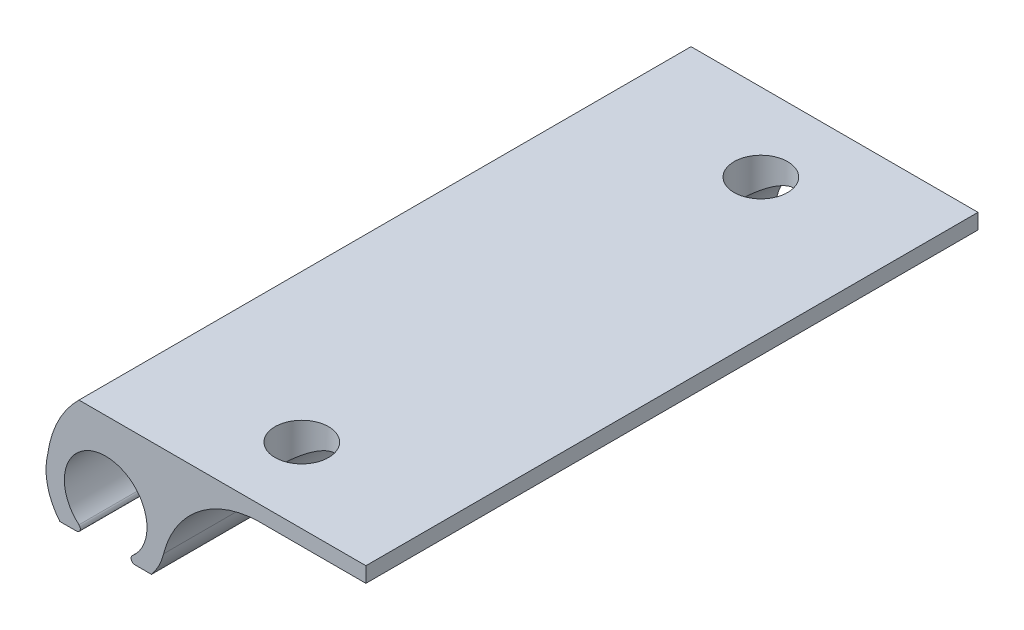
ISO-10303-21;
HEADER;
FILE_DESCRIPTION(('STEP AP214'),'2;1');
FILE_NAME('part.step','',(''),(''),'','','');
FILE_SCHEMA(('AUTOMOTIVE_DESIGN { 1 0 10303 214 1 1 1 1 }'));
ENDSEC;
DATA;
#1=APPLICATION_CONTEXT('core data for automotive mechanical design processes');
#2=APPLICATION_PROTOCOL_DEFINITION('international standard','automotive_design',2000,#1);
#3=PRODUCT_CONTEXT('',#1,'mechanical');
#4=PRODUCT('Part','Part','',(#3));
#5=PRODUCT_RELATED_PRODUCT_CATEGORY('part','',(#4));
#6=PRODUCT_DEFINITION_FORMATION('','',#4);
#7=PRODUCT_DEFINITION_CONTEXT('part definition',#1,'design');
#8=PRODUCT_DEFINITION('design','',#6,#7);
#9=PRODUCT_DEFINITION_SHAPE('','',#8);
#10=(LENGTH_UNIT() NAMED_UNIT(*) SI_UNIT(.MILLI.,.METRE.));
#11=(NAMED_UNIT(*) PLANE_ANGLE_UNIT() SI_UNIT($,.RADIAN.));
#12=(NAMED_UNIT(*) SI_UNIT($,.STERADIAN.) SOLID_ANGLE_UNIT());
#13=UNCERTAINTY_MEASURE_WITH_UNIT(LENGTH_MEASURE(1.E-05),#10,'distance_accuracy_value','');
#14=(GEOMETRIC_REPRESENTATION_CONTEXT(3) GLOBAL_UNCERTAINTY_ASSIGNED_CONTEXT((#13)) GLOBAL_UNIT_ASSIGNED_CONTEXT((#10,
#11,#12)) REPRESENTATION_CONTEXT('',''));
#15=CARTESIAN_POINT('',(0.,0.,0.));
#16=DIRECTION('',(0.,0.,1.));
#17=DIRECTION('',(1.,0.,0.));
#18=AXIS2_PLACEMENT_3D('',#15,#16,#17);
#19=CARTESIAN_POINT('',(0.,0.,0.));
#20=DIRECTION('',(0.,1.,0.));
#21=DIRECTION('',(0.,0.,1.));
#22=AXIS2_PLACEMENT_3D('',#19,#20,#21);
#23=PLANE('',#22);
#24=DIRECTION('',(1.,0.,0.));
#25=VECTOR('',#24,1.);
#26=CARTESIAN_POINT('',(0.,0.,-20.));
#27=LINE('',#26,#25);
#28=CARTESIAN_POINT('',(-34.815449133055,0.,-20.));
#29=VERTEX_POINT('',#28);
#30=CARTESIAN_POINT('',(-27.815449133055,0.,-20.));
#31=VERTEX_POINT('',#30);
#32=EDGE_CURVE('E174',#29,#31,#27,.T.);
#33=ORIENTED_EDGE('',*,*,#32,.T.);
#34=DIRECTION('',(0.,0.,-1.));
#35=VECTOR('',#34,1.);
#36=CARTESIAN_POINT('',(-27.815449133055,0.,20.));
#37=LINE('',#36,#35);
#38=CARTESIAN_POINT('',(-27.815449133055,0.,20.));
#39=VERTEX_POINT('',#38);
#40=EDGE_CURVE('E147',#39,#31,#37,.T.);
#41=ORIENTED_EDGE('',*,*,#40,.F.);
#42=DIRECTION('',(-1.,0.,0.));
#43=VECTOR('',#42,1.);
#44=CARTESIAN_POINT('',(0.,0.,20.));
#45=LINE('',#44,#43);
#46=CARTESIAN_POINT('',(-34.815449133055,0.,20.));
#47=VERTEX_POINT('',#46);
#48=EDGE_CURVE('E53',#39,#47,#45,.T.);
#49=ORIENTED_EDGE('',*,*,#48,.T.);
#50=DIRECTION('',(0.,0.,-1.));
#51=VECTOR('',#50,1.);
#52=CARTESIAN_POINT('',(-34.815449133055,0.,20.));
#53=LINE('',#52,#51);
#54=EDGE_CURVE('E230',#47,#29,#53,.T.);
#55=ORIENTED_EDGE('',*,*,#54,.T.);
#56=EDGE_LOOP('',(#33,#41,#49,#55));
#57=FACE_BOUND('',#56,.T.);
#58=ADVANCED_FACE('F49',(#57),#23,.F.);
#59=CARTESIAN_POINT('',(-41.6688788785881,-4.,20.));
#60=DIRECTION('',(0.,0.,-1.));
#61=DIRECTION('',(-1.,0.,0.));
#62=AXIS2_PLACEMENT_3D('',#59,#60,#61);
#63=CYLINDRICAL_SURFACE('',#62,7.);
#64=CARTESIAN_POINT('',(-41.6688788785881,-4.,20.));
#65=DIRECTION('',(0.,0.,1.));
#66=DIRECTION('',(1.,0.,0.));
#67=AXIS2_PLACEMENT_3D('',#64,#65,#66);
#68=CIRCLE('',#67,7.);
#69=CARTESIAN_POINT('',(-46.5678583641544,0.999999999999998,20.));
#70=VERTEX_POINT('',#69);
#71=CARTESIAN_POINT('',(-48.6037787695308,-3.04754868754246,20.));
#72=VERTEX_POINT('',#71);
#73=EDGE_CURVE('E213',#70,#72,#68,.T.);
#74=ORIENTED_EDGE('',*,*,#73,.F.);
#75=DIRECTION('',(0.,0.,-1.));
#76=VECTOR('',#75,1.);
#77=CARTESIAN_POINT('',(-46.5678583641544,0.999999999999997,20.));
#78=LINE('',#77,#76);
#79=CARTESIAN_POINT('',(-46.5678583641544,0.999999999999998,-20.));
#80=VERTEX_POINT('',#79);
#81=EDGE_CURVE('E160',#70,#80,#78,.T.);
#82=ORIENTED_EDGE('',*,*,#81,.T.);
#83=CARTESIAN_POINT('',(-41.6688788785881,-4.,-20.));
#84=DIRECTION('',(0.,0.,1.));
#85=DIRECTION('',(1.,0.,0.));
#86=AXIS2_PLACEMENT_3D('',#83,#84,#85);
#87=CIRCLE('',#86,7.);
#88=CARTESIAN_POINT('',(-48.6037787695308,-3.04754868754246,-20.));
#89=VERTEX_POINT('',#88);
#90=EDGE_CURVE('E211',#80,#89,#87,.T.);
#91=ORIENTED_EDGE('',*,*,#90,.T.);
#92=DIRECTION('',(0.,0.,-1.));
#93=VECTOR('',#92,1.);
#94=CARTESIAN_POINT('',(-48.6037787695308,-3.04754868754246,0.));
#95=LINE('',#94,#93);
#96=EDGE_CURVE('E207',#72,#89,#95,.T.);
#97=ORIENTED_EDGE('',*,*,#96,.F.);
#98=EDGE_LOOP('',(#74,#82,#91,#97));
#99=FACE_BOUND('',#98,.T.);
#100=ADVANCED_FACE('F318',(#99),#63,.T.);
#101=CARTESIAN_POINT('',(-34.7077245665274,-6.52327281494367,20.));
#102=DIRECTION('',(0.,0.,-1.));
#103=DIRECTION('',(-1.,0.,0.));
#104=AXIS2_PLACEMENT_3D('',#101,#102,#103);
#105=CYLINDRICAL_SURFACE('',#104,6.52416222977454);
#106=CARTESIAN_POINT('',(-36.905449133055,-0.380415211995519,-13.15));
#107=CARTESIAN_POINT('',(-37.0120612174881,-0.418559683321366,-13.1500012489394));
#108=CARTESIAN_POINT('',(-37.117677753098,-0.459506651884738,-13.1597648629578));
#109=CARTESIAN_POINT('',(-37.3238299126283,-0.54554792152719,-13.1975135666325));
#110=CARTESIAN_POINT('',(-37.4243625901667,-0.59064458585379,-13.2255090951881));
#111=CARTESIAN_POINT('',(-37.6176478224626,-0.683026311581428,-13.2981571342724));
#112=CARTESIAN_POINT('',(-37.7104248594172,-0.730303694181502,-13.3427546023574));
#113=CARTESIAN_POINT('',(-37.8867418832714,-0.825152404039009,-13.447387437694));
#114=CARTESIAN_POINT('',(-37.9702758359885,-0.872723902159688,-13.5074328057838));
#115=CARTESIAN_POINT('',(-38.1304984084731,-0.968232811214526,-13.6455877873557));
#116=CARTESIAN_POINT('',(-38.2065704235301,-1.01605024793492,-13.7245002329455));
#117=CARTESIAN_POINT('',(-38.3438718348947,-1.10572333358659,-13.8972208986429));
#118=CARTESIAN_POINT('',(-38.4051240479857,-1.14758810581545,-13.9910058474635));
#119=CARTESIAN_POINT('',(-38.4956509421523,-1.21116314655366,-14.1647369557746));
#120=CARTESIAN_POINT('',(-38.5290958384909,-1.23526692108566,-14.2416399781403));
#121=CARTESIAN_POINT('',(-38.5849759726585,-1.27610049253628,-14.4011890877591));
#122=CARTESIAN_POINT('',(-38.6074231948711,-1.29283831424599,-14.4838288109522));
#123=CARTESIAN_POINT('',(-38.6401402976036,-1.31738823046744,-14.6533497142686));
#124=CARTESIAN_POINT('',(-38.6503360799403,-1.32514600231506,-14.7402534270903));
#125=CARTESIAN_POINT('',(-38.657564710571,-1.33063555395343,-14.9149247917332));
#126=CARTESIAN_POINT('',(-38.6546008775228,-1.32836986151214,-15.002692220168));
#127=CARTESIAN_POINT('',(-38.6366533166324,-1.31478832377693,-15.1676974529926));
#128=CARTESIAN_POINT('',(-38.6228406809358,-1.30435453949581,-15.2451422689065));
#129=CARTESIAN_POINT('',(-38.5854084056611,-1.27648327450416,-15.3962894899382));
#130=CARTESIAN_POINT('',(-38.5617860656252,-1.25904386529811,-15.4699908582685));
#131=CARTESIAN_POINT('',(-38.5041248602786,-1.21729794725611,-15.6164434148406));
#132=CARTESIAN_POINT('',(-38.4695568781891,-1.19264902199137,-15.6888860523496));
#133=CARTESIAN_POINT('',(-38.3918326272387,-1.13863911345378,-15.8270694268693));
#134=CARTESIAN_POINT('',(-38.3486722734255,-1.10927589021745,-15.8928069535944));
#135=CARTESIAN_POINT('',(-38.2464026033518,-1.04177323993592,-16.028173022548));
#136=CARTESIAN_POINT('',(-38.185820948301,-1.00300512767772,-16.0963757738643));
#137=CARTESIAN_POINT('',(-38.0556742726746,-0.923114879622461,-16.221996410387));
#138=CARTESIAN_POINT('',(-37.9861025516363,-0.881991000885286,-16.2794061722335));
#139=CARTESIAN_POINT('',(-37.8274496806762,-0.792517702454995,-16.3910609733628));
#140=CARTESIAN_POINT('',(-37.7370278333466,-0.744064482213994,-16.4433317289481));
#141=CARTESIAN_POINT('',(-37.547646371303,-0.648684844915986,-16.5312524147146));
#142=CARTESIAN_POINT('',(-37.4486838569854,-0.601758953901045,-16.5668966735937));
#143=CARTESIAN_POINT('',(-37.2413141212884,-0.510050986661696,-16.6209039975812));
#144=CARTESIAN_POINT('',(-37.132711412004,-0.465377196289421,-16.6387097590541));
#145=CARTESIAN_POINT('',(-36.9119764592038,-0.381622542755841,-16.6534732907532));
#146=CARTESIAN_POINT('',(-36.7998464614505,-0.3425382054226,-16.6504440691364));
#147=CARTESIAN_POINT('',(-36.585122497742,-0.274133357728756,-16.6235544941321));
#148=CARTESIAN_POINT('',(-36.4824869370778,-0.244280370137848,-16.6013892374879));
#149=CARTESIAN_POINT('',(-36.2814090322889,-0.190894398217032,-16.5383392264156));
#150=CARTESIAN_POINT('',(-36.1829644413657,-0.167357990705581,-16.4974646438715));
#151=CARTESIAN_POINT('',(-36.0020726920874,-0.128179328476227,-16.4019954459508));
#152=CARTESIAN_POINT('',(-35.9189760643054,-0.112042607817394,-16.3488283651228));
#153=CARTESIAN_POINT('',(-35.7624458927773,-0.0844392723122067,-16.2288200379896));
#154=CARTESIAN_POINT('',(-35.6890107912133,-0.0729719039565382,-16.1619810005921));
#155=CARTESIAN_POINT('',(-35.556210654767,-0.054181042661486,-16.0186302845372));
#156=CARTESIAN_POINT('',(-35.4965048261907,-0.0467489597657756,-15.9424478089087));
#157=CARTESIAN_POINT('',(-35.3903821424116,-0.0347034614949397,-15.7811316493004));
#158=CARTESIAN_POINT('',(-35.3439654115322,-0.0300900724890615,-15.6959978815889));
#159=CARTESIAN_POINT('',(-35.2655765831669,-0.0228835471773525,-15.5186816993285));
#160=CARTESIAN_POINT('',(-35.2336854901731,-0.0203016832670951,-15.4264630292212));
#161=CARTESIAN_POINT('',(-35.1856450212708,-0.016593936276328,-15.2379837103672));
#162=CARTESIAN_POINT('',(-35.1694962928943,-0.0154681130866467,-15.1417228955244));
#163=CARTESIAN_POINT('',(-35.1533410212967,-0.0143414460861393,-14.947121903136));
#164=CARTESIAN_POINT('',(-35.1534561421114,-0.0143490812935133,-14.8487715571267));
#165=CARTESIAN_POINT('',(-35.1701300305847,-0.0155127031863204,-14.6534796172731));
#166=CARTESIAN_POINT('',(-35.18668919781,-0.0166687177757128,-14.5565380577184));
#167=CARTESIAN_POINT('',(-35.2358103595884,-0.0204718284576052,-14.3666756460411));
#168=CARTESIAN_POINT('',(-35.2683954976183,-0.0231210817813355,-14.2737608208058));
#169=CARTESIAN_POINT('',(-35.3486210799704,-0.0305416158976198,-14.0947644990905));
#170=CARTESIAN_POINT('',(-35.3962612084217,-0.0353128521693755,-14.0086828592899));
#171=CARTESIAN_POINT('',(-35.5049344657744,-0.0477714902014458,-13.8461613673528));
#172=CARTESIAN_POINT('',(-35.5659139692753,-0.0554473030103386,-13.7696847864279));
#173=CARTESIAN_POINT('',(-35.6994523427343,-0.0745748917728855,-13.6281771927333));
#174=CARTESIAN_POINT('',(-35.7720098765567,-0.0860262321829169,-13.5631448610853));
#175=CARTESIAN_POINT('',(-35.9256276812455,-0.113325621254146,-13.4468497693552));
#176=CARTESIAN_POINT('',(-36.0066039527197,-0.129132422896607,-13.3954663028814));
#177=CARTESIAN_POINT('',(-36.1749498785029,-0.165651132251371,-13.3069157876761));
#178=CARTESIAN_POINT('',(-36.2623191095149,-0.186362715406134,-13.2697477987083));
#179=CARTESIAN_POINT('',(-36.4419205707679,-0.233123504678588,-13.2098142039772));
#180=CARTESIAN_POINT('',(-36.5342035161868,-0.259242902262076,-13.1872559731888));
#181=CARTESIAN_POINT('',(-36.7197234930544,-0.316342106704015,-13.1573449138887));
#182=CARTESIAN_POINT('',(-36.8129609342472,-0.347324090419957,-13.1499989165191));
#183=CARTESIAN_POINT('',(-36.905449133055,-0.380415211995519,-13.15));
#184=B_SPLINE_CURVE_WITH_KNOTS('',3,(#106,#107,#108,#109,#110,#111,#112,#113,#114,#115,#116,
#117,#118,#119,#120,#121,#122,#123,#124,#125,#126,#127,#128,#129,#130,#131,#132,#133,#134,#135,
#136,#137,#138,#139,#140,#141,#142,#143,#144,#145,#146,#147,#148,#149,#150,#151,#152,#153,#154,
#155,#156,#157,#158,#159,#160,#161,#162,#163,#164,#165,#166,#167,#168,#169,#170,#171,#172,#173,
#174,#175,#176,#177,#178,#179,#180,#181,#182,#183),.UNSPECIFIED.,.T.,.F.,(4,2,2,2,2,2,2,2,2,2,2,
2,2,2,2,2,2,2,2,2,2,2,2,2,2,2,2,2,2,2,2,2,2,2,2,2,2,2,4),(0.,0.339303226248111,
0.678800895592475,1.01718286853229,1.35578446074855,1.71274241120337,2.06914723599101,
2.32987996811834,2.590327939132,2.85234332756748,3.11429264340347,3.35130569943222,
3.58838404473639,3.83934980528291,4.09043516516808,4.38666859829707,4.68312410708754,
5.02698823940277,5.37096957824177,5.72539051500746,6.0795901919599,6.40530071120272,
6.73083435813891,7.02923469645259,7.32758686178326,7.61745275229418,7.90732135449664,
8.19878723630126,8.49026510649174,8.78392353293339,9.07758909502494,9.37167999717276,
9.6657647293633,9.95868825949586,10.2515780098827,10.5417841055883,10.8319710032377,
11.1261915104402,11.4205441104499),.UNSPECIFIED.);
#185=CARTESIAN_POINT('',(-36.905449133055,-0.380415211995519,-13.15));
#186=VERTEX_POINT('',#185);
#187=EDGE_CURVE('E357',#186,#186,#184,.T.);
#188=ORIENTED_EDGE('',*,*,#187,.F.);
#189=EDGE_LOOP('',(#188));
#190=FACE_BOUND('',#189,.T.);
#191=CARTESIAN_POINT('',(-36.905449133055,-0.380415211995519,16.85));
#192=CARTESIAN_POINT('',(-37.0120612174881,-0.418559683321366,16.8499987510606));
#193=CARTESIAN_POINT('',(-37.117677753098,-0.459506651884738,16.8402351370422));
#194=CARTESIAN_POINT('',(-37.3238299126283,-0.545547921527191,16.8024864333675));
#195=CARTESIAN_POINT('',(-37.4243625901667,-0.590644585853791,16.7744909048119));
#196=CARTESIAN_POINT('',(-37.6176478224626,-0.683026311581428,16.7018428657276));
#197=CARTESIAN_POINT('',(-37.7104248594172,-0.730303694181502,16.6572453976426));
#198=CARTESIAN_POINT('',(-37.8867418832714,-0.825152404039007,16.552612562306));
#199=CARTESIAN_POINT('',(-37.9702758359885,-0.872723902159684,16.4925671942162));
#200=CARTESIAN_POINT('',(-38.1304984084731,-0.968232811214522,16.3544122126443));
#201=CARTESIAN_POINT('',(-38.2065704235301,-1.01605024793492,16.2754997670545));
#202=CARTESIAN_POINT('',(-38.3438718348947,-1.10572333358659,16.1027791013571));
#203=CARTESIAN_POINT('',(-38.4051240479857,-1.14758810581545,16.0089941525365));
#204=CARTESIAN_POINT('',(-38.4956509421523,-1.21116314655366,15.8352630442254));
#205=CARTESIAN_POINT('',(-38.5290958384909,-1.23526692108566,15.7583600218597));
#206=CARTESIAN_POINT('',(-38.5849759726585,-1.27610049253627,15.5988109122409));
#207=CARTESIAN_POINT('',(-38.6074231948711,-1.29283831424599,15.5161711890478));
#208=CARTESIAN_POINT('',(-38.6401402976036,-1.31738823046744,15.3466502857314));
#209=CARTESIAN_POINT('',(-38.6503360799403,-1.32514600231506,15.2597465729097));
#210=CARTESIAN_POINT('',(-38.657564710571,-1.33063555395343,15.0850752082668));
#211=CARTESIAN_POINT('',(-38.6546008775228,-1.32836986151214,14.997307779832));
#212=CARTESIAN_POINT('',(-38.6366533166324,-1.31478832377693,14.8323025470074));
#213=CARTESIAN_POINT('',(-38.6228406809358,-1.30435453949581,14.7548577310935));
#214=CARTESIAN_POINT('',(-38.5854084056611,-1.27648327450416,14.6037105100618));
#215=CARTESIAN_POINT('',(-38.5617860656252,-1.25904386529811,14.5300091417315));
#216=CARTESIAN_POINT('',(-38.5041248602786,-1.21729794725611,14.3835565851594));
#217=CARTESIAN_POINT('',(-38.4695568781891,-1.19264902199138,14.3111139476504));
#218=CARTESIAN_POINT('',(-38.3918326272388,-1.13863911345378,14.1729305731307));
#219=CARTESIAN_POINT('',(-38.3486722734255,-1.10927589021745,14.1071930464056));
#220=CARTESIAN_POINT('',(-38.2464026033518,-1.04177323993593,13.971826977452));
#221=CARTESIAN_POINT('',(-38.185820948301,-1.00300512767773,13.9036242261357));
#222=CARTESIAN_POINT('',(-38.0556742726746,-0.923114879622463,13.778003589613));
#223=CARTESIAN_POINT('',(-37.9861025516363,-0.881991000885287,13.7205938277665));
#224=CARTESIAN_POINT('',(-37.8274496806762,-0.792517702454997,13.6089390266372));
#225=CARTESIAN_POINT('',(-37.7370278333466,-0.744064482213997,13.5566682710519));
#226=CARTESIAN_POINT('',(-37.547646371303,-0.648684844915988,13.4687475852854));
#227=CARTESIAN_POINT('',(-37.4486838569854,-0.601758953901046,13.4331033264063));
#228=CARTESIAN_POINT('',(-37.2413141212884,-0.510050986661695,13.3790960024188));
#229=CARTESIAN_POINT('',(-37.132711412004,-0.46537719628942,13.3612902409459));
#230=CARTESIAN_POINT('',(-36.9119764592038,-0.381622542755842,13.3465267092468));
#231=CARTESIAN_POINT('',(-36.7998464614505,-0.342538205422603,13.3495559308636));
#232=CARTESIAN_POINT('',(-36.585122497742,-0.27413335772876,13.3764455058679));
#233=CARTESIAN_POINT('',(-36.4824869370778,-0.244280370137851,13.3986107625121));
#234=CARTESIAN_POINT('',(-36.2814090322889,-0.190894398217033,13.4616607735844));
#235=CARTESIAN_POINT('',(-36.1829644413657,-0.167357990705582,13.5025353561284));
#236=CARTESIAN_POINT('',(-36.0020726920874,-0.128179328476228,13.5980045540492));
#237=CARTESIAN_POINT('',(-35.9189760643054,-0.112042607817396,13.6511716348772));
#238=CARTESIAN_POINT('',(-35.7624458927773,-0.0844392723122075,13.7711799620104));
#239=CARTESIAN_POINT('',(-35.6890107912133,-0.0729719039565382,13.8380189994079));
#240=CARTESIAN_POINT('',(-35.556210654767,-0.0541810426614861,13.9813697154628));
#241=CARTESIAN_POINT('',(-35.4965048261907,-0.0467489597657764,14.0575521910913));
#242=CARTESIAN_POINT('',(-35.3903821424116,-0.0347034614949401,14.2188683506996));
#243=CARTESIAN_POINT('',(-35.3439654115322,-0.030090072489061,14.3040021184111));
#244=CARTESIAN_POINT('',(-35.2655765831669,-0.0228835471773514,14.4813183006715));
#245=CARTESIAN_POINT('',(-35.2336854901731,-0.0203016832670945,14.5735369707788));
#246=CARTESIAN_POINT('',(-35.1856450212708,-0.0165939362763279,14.7620162896328));
#247=CARTESIAN_POINT('',(-35.1694962928943,-0.0154681130866466,14.8582771044756));
#248=CARTESIAN_POINT('',(-35.1533410212967,-0.0143414460861396,15.052878096864));
#249=CARTESIAN_POINT('',(-35.1534561421114,-0.0143490812935139,15.1512284428733));
#250=CARTESIAN_POINT('',(-35.1701300305847,-0.0155127031863212,15.3465203827269));
#251=CARTESIAN_POINT('',(-35.18668919781,-0.0166687177757134,15.4434619422816));
#252=CARTESIAN_POINT('',(-35.2358103595884,-0.0204718284576053,15.6333243539589));
#253=CARTESIAN_POINT('',(-35.2683954976183,-0.0231210817813352,15.7262391791942));
#254=CARTESIAN_POINT('',(-35.3486210799704,-0.0305416158976194,15.9052355009095));
#255=CARTESIAN_POINT('',(-35.3962612084217,-0.0353128521693753,15.9913171407101));
#256=CARTESIAN_POINT('',(-35.5049344657744,-0.0477714902014452,16.1538386326472));
#257=CARTESIAN_POINT('',(-35.5659139692753,-0.0554473030103373,16.2303152135721));
#258=CARTESIAN_POINT('',(-35.6994523427343,-0.0745748917728837,16.3718228072667));
#259=CARTESIAN_POINT('',(-35.7720098765567,-0.0860262321829153,16.4368551389147));
#260=CARTESIAN_POINT('',(-35.9256276812455,-0.113325621254145,16.5531502306448));
#261=CARTESIAN_POINT('',(-36.0066039527197,-0.129132422896606,16.6045336971186));
#262=CARTESIAN_POINT('',(-36.1749498785029,-0.16565113225137,16.6930842123239));
#263=CARTESIAN_POINT('',(-36.2623191095149,-0.186362715406133,16.7302522012917));
#264=CARTESIAN_POINT('',(-36.4419205707678,-0.233123504678586,16.7901857960228));
#265=CARTESIAN_POINT('',(-36.5342035161868,-0.259242902262074,16.8127440268112));
#266=CARTESIAN_POINT('',(-36.7197234930544,-0.316342106704014,16.8426550861113));
#267=CARTESIAN_POINT('',(-36.8129609342472,-0.347324090419957,16.8500010834809));
#268=CARTESIAN_POINT('',(-36.905449133055,-0.380415211995519,16.85));
#269=B_SPLINE_CURVE_WITH_KNOTS('',3,(#191,#192,#193,#194,#195,#196,#197,#198,#199,#200,#201,
#202,#203,#204,#205,#206,#207,#208,#209,#210,#211,#212,#213,#214,#215,#216,#217,#218,#219,#220,
#221,#222,#223,#224,#225,#226,#227,#228,#229,#230,#231,#232,#233,#234,#235,#236,#237,#238,#239,
#240,#241,#242,#243,#244,#245,#246,#247,#248,#249,#250,#251,#252,#253,#254,#255,#256,#257,#258,
#259,#260,#261,#262,#263,#264,#265,#266,#267,#268),.UNSPECIFIED.,.T.,.F.,(4,2,2,2,2,2,2,2,2,2,2,
2,2,2,2,2,2,2,2,2,2,2,2,2,2,2,2,2,2,2,2,2,2,2,2,2,2,2,4),(0.,0.339303226248111,
0.678800895592475,1.0171828685323,1.35578446074854,1.71274241120337,2.06914723599101,
2.32987996811834,2.59032793913199,2.85234332756748,3.11429264340346,3.35130569943221,
3.58838404473638,3.8393498052829,4.09043516516807,4.38666859829706,4.68312410708753,
5.02698823940277,5.37096957824176,5.72539051500746,6.07959019195988,6.40530071120271,
6.7308343581389,7.02923469645258,7.32758686178325,7.61745275229418,7.90732135449663,
8.19878723630126,8.49026510649173,8.78392353293338,9.07758909502493,9.37167999717274,
9.66576472936329,9.95868825949584,10.2515780098827,10.5417841055883,10.8319710032377,
11.1261915104402,11.4205441104499),.UNSPECIFIED.);
#270=CARTESIAN_POINT('',(-36.905449133055,-0.380415211995519,16.85));
#271=VERTEX_POINT('',#270);
#272=EDGE_CURVE('E348',#271,#271,#269,.T.);
#273=ORIENTED_EDGE('',*,*,#272,.F.);
#274=EDGE_LOOP('',(#273));
#275=FACE_BOUND('',#274,.T.);
#276=CARTESIAN_POINT('',(-34.7077245665274,-6.52327281494367,20.));
#277=DIRECTION('',(0.,0.,1.));
#278=DIRECTION('',(1.,0.,0.));
#279=AXIS2_PLACEMENT_3D('',#276,#277,#278);
#280=CIRCLE('',#279,6.52416222977454);
#281=CARTESIAN_POINT('',(-41.0357602100111,-4.935614887298,20.));
#282=VERTEX_POINT('',#281);
#283=EDGE_CURVE('E220',#47,#282,#280,.T.);
#284=ORIENTED_EDGE('',*,*,#283,.T.);
#285=DIRECTION('',(0.,0.,-1.));
#286=VECTOR('',#285,1.);
#287=CARTESIAN_POINT('',(-41.0357602100111,-4.935614887298,0.));
#288=LINE('',#287,#286);
#289=CARTESIAN_POINT('',(-41.0357602100111,-4.935614887298,-20.));
#290=VERTEX_POINT('',#289);
#291=EDGE_CURVE('E212',#282,#290,#288,.T.);
#292=ORIENTED_EDGE('',*,*,#291,.T.);
#293=CARTESIAN_POINT('',(-34.7077245665274,-6.52327281494367,-20.));
#294=DIRECTION('',(0.,0.,1.));
#295=DIRECTION('',(1.,0.,0.));
#296=AXIS2_PLACEMENT_3D('',#293,#294,#295);
#297=CIRCLE('',#296,6.52416222977454);
#298=EDGE_CURVE('E217',#29,#290,#297,.T.);
#299=ORIENTED_EDGE('',*,*,#298,.F.);
#300=ORIENTED_EDGE('',*,*,#54,.F.);
#301=EDGE_LOOP('',(#284,#292,#299,#300));
#302=FACE_BOUND('',#301,.T.);
#303=ADVANCED_FACE('F302',(#190,#275,#302),#105,.F.);
#304=CARTESIAN_POINT('',(0.,0.,20.));
#305=DIRECTION('',(0.,0.,1.));
#306=DIRECTION('',(1.,0.,0.));
#307=AXIS2_PLACEMENT_3D('',#304,#305,#306);
#308=PLANE('',#307);
#309=DIRECTION('',(0.,-1.,0.));
#310=VECTOR('',#309,1.);
#311=CARTESIAN_POINT('',(-27.815449133055,0.999999999999998,20.));
#312=LINE('',#311,#310);
#313=CARTESIAN_POINT('',(-27.815449133055,0.999999999999998,20.));
#314=VERTEX_POINT('',#313);
#315=EDGE_CURVE('E141',#314,#39,#312,.T.);
#316=ORIENTED_EDGE('',*,*,#315,.F.);
#317=DIRECTION('',(1.,0.,0.));
#318=VECTOR('',#317,1.);
#319=CARTESIAN_POINT('',(-50.,0.999999999999998,20.));
#320=LINE('',#319,#318);
#321=EDGE_CURVE('E153',#70,#314,#320,.T.);
#322=ORIENTED_EDGE('',*,*,#321,.F.);
#323=ORIENTED_EDGE('',*,*,#73,.T.);
#324=CARTESIAN_POINT('',(-44.82186966203,-4.,20.));
#325=DIRECTION('',(0.,0.,1.));
#326=DIRECTION('',(1.,0.,0.));
#327=AXIS2_PLACEMENT_3D('',#324,#325,#326);
#328=CIRCLE('',#327,3.9);
#329=CARTESIAN_POINT('',(-47.8152623860139,-6.49991999871995,20.));
#330=VERTEX_POINT('',#329);
#331=EDGE_CURVE('E182',#72,#330,#328,.T.);
#332=ORIENTED_EDGE('',*,*,#331,.T.);
#333=DIRECTION('',(1.,0.,0.));
#334=VECTOR('',#333,1.);
#335=CARTESIAN_POINT('',(-47.8152623860139,-6.49991999871995,20.));
#336=LINE('',#335,#334);
#337=CARTESIAN_POINT('',(-46.7298424079988,-6.49991999871995,20.));
#338=VERTEX_POINT('',#337);
#339=EDGE_CURVE('E186',#330,#338,#336,.T.);
#340=ORIENTED_EDGE('',*,*,#339,.T.);
#341=CARTESIAN_POINT('',(-46.7298424079988,-6.24991999871995,20.));
#342=DIRECTION('',(0.,0.,1.));
#343=DIRECTION('',(1.,0.,0.));
#344=AXIS2_PLACEMENT_3D('',#341,#342,#343);
#345=CIRCLE('',#344,0.25);
#346=CARTESIAN_POINT('',(-46.5681498024083,-6.05924881238775,20.));
#347=VERTEX_POINT('',#346);
#348=EDGE_CURVE('E260',#338,#347,#345,.T.);
#349=ORIENTED_EDGE('',*,*,#348,.T.);
#350=CARTESIAN_POINT('',(-44.82186966203,-4.,20.));
#351=DIRECTION('',(0.,0.,1.));
#352=DIRECTION('',(1.,0.,0.));
#353=AXIS2_PLACEMENT_3D('',#350,#351,#352);
#354=CIRCLE('',#353,2.7);
#355=CARTESIAN_POINT('',(-43.0755895216517,-6.05924881238776,20.));
#356=VERTEX_POINT('',#355);
#357=EDGE_CURVE('E216',#356,#347,#354,.T.);
#358=ORIENTED_EDGE('',*,*,#357,.F.);
#359=CARTESIAN_POINT('',(-42.9138969160611,-6.24991999871996,20.));
#360=DIRECTION('',(0.,0.,1.));
#361=DIRECTION('',(1.,0.,0.));
#362=AXIS2_PLACEMENT_3D('',#359,#360,#361);
#363=CIRCLE('',#362,0.25);
#364=CARTESIAN_POINT('',(-42.9138969160611,-6.49991999871996,20.));
#365=VERTEX_POINT('',#364);
#366=EDGE_CURVE('E60',#356,#365,#363,.T.);
#367=ORIENTED_EDGE('',*,*,#366,.T.);
#368=DIRECTION('',(1.,0.,0.));
#369=VECTOR('',#368,1.);
#370=CARTESIAN_POINT('',(-43.80186966203,-6.49991999871996,20.));
#371=LINE('',#370,#369);
#372=CARTESIAN_POINT('',(-41.828476938046,-6.49991999871996,20.));
#373=VERTEX_POINT('',#372);
#374=EDGE_CURVE('E179',#365,#373,#371,.T.);
#375=ORIENTED_EDGE('',*,*,#374,.T.);
#376=CARTESIAN_POINT('',(-44.82186966203,-4.,20.));
#377=DIRECTION('',(0.,0.,1.));
#378=DIRECTION('',(1.,0.,0.));
#379=AXIS2_PLACEMENT_3D('',#376,#377,#378);
#380=CIRCLE('',#379,3.9);
#381=EDGE_CURVE('E206',#373,#282,#380,.T.);
#382=ORIENTED_EDGE('',*,*,#381,.T.);
#383=ORIENTED_EDGE('',*,*,#283,.F.);
#384=ORIENTED_EDGE('',*,*,#48,.F.);
#385=EDGE_LOOP('',(#316,#322,#323,#332,#340,#349,#358,#367,#375,#382,#383,#384));
#386=FACE_BOUND('',#385,.T.);
#387=ADVANCED_FACE('F152',(#386),#308,.T.);
#388=CARTESIAN_POINT('',(0.,0.,-20.));
#389=DIRECTION('',(0.,0.,1.));
#390=DIRECTION('',(1.,0.,0.));
#391=AXIS2_PLACEMENT_3D('',#388,#389,#390);
#392=PLANE('',#391);
#393=DIRECTION('',(1.,0.,0.));
#394=VECTOR('',#393,1.);
#395=CARTESIAN_POINT('',(0.,0.999999999999998,-20.));
#396=LINE('',#395,#394);
#397=CARTESIAN_POINT('',(-27.815449133055,0.999999999999998,-20.));
#398=VERTEX_POINT('',#397);
#399=EDGE_CURVE('E162',#80,#398,#396,.T.);
#400=ORIENTED_EDGE('',*,*,#399,.T.);
#401=DIRECTION('',(0.,-1.,0.));
#402=VECTOR('',#401,1.);
#403=CARTESIAN_POINT('',(-27.815449133055,0.999999999999998,-20.));
#404=LINE('',#403,#402);
#405=EDGE_CURVE('E67',#398,#31,#404,.T.);
#406=ORIENTED_EDGE('',*,*,#405,.T.);
#407=ORIENTED_EDGE('',*,*,#32,.F.);
#408=ORIENTED_EDGE('',*,*,#298,.T.);
#409=CARTESIAN_POINT('',(-44.82186966203,-4.,-20.));
#410=DIRECTION('',(0.,0.,1.));
#411=DIRECTION('',(1.,0.,0.));
#412=AXIS2_PLACEMENT_3D('',#409,#410,#411);
#413=CIRCLE('',#412,3.9);
#414=CARTESIAN_POINT('',(-41.828476938046,-6.49991999871996,-20.));
#415=VERTEX_POINT('',#414);
#416=EDGE_CURVE('E193',#415,#290,#413,.T.);
#417=ORIENTED_EDGE('',*,*,#416,.F.);
#418=DIRECTION('',(1.,0.,0.));
#419=VECTOR('',#418,1.);
#420=CARTESIAN_POINT('',(-43.80186966203,-6.49991999871996,-20.));
#421=LINE('',#420,#419);
#422=CARTESIAN_POINT('',(-42.9138969160611,-6.49991999871996,-20.));
#423=VERTEX_POINT('',#422);
#424=EDGE_CURVE('E178',#423,#415,#421,.T.);
#425=ORIENTED_EDGE('',*,*,#424,.F.);
#426=CARTESIAN_POINT('',(-42.9138969160611,-6.24991999871996,-20.));
#427=DIRECTION('',(0.,0.,1.));
#428=DIRECTION('',(1.,0.,0.));
#429=AXIS2_PLACEMENT_3D('',#426,#427,#428);
#430=CIRCLE('',#429,0.25);
#431=CARTESIAN_POINT('',(-43.0755895216517,-6.05924881238776,-20.));
#432=VERTEX_POINT('',#431);
#433=EDGE_CURVE('E250',#423,#432,#430,.F.);
#434=ORIENTED_EDGE('',*,*,#433,.T.);
#435=CARTESIAN_POINT('',(-44.82186966203,-4.,-20.));
#436=DIRECTION('',(0.,0.,1.));
#437=DIRECTION('',(1.,0.,0.));
#438=AXIS2_PLACEMENT_3D('',#435,#436,#437);
#439=CIRCLE('',#438,2.7);
#440=CARTESIAN_POINT('',(-46.5681498024083,-6.05924881238775,-20.));
#441=VERTEX_POINT('',#440);
#442=EDGE_CURVE('E223',#432,#441,#439,.T.);
#443=ORIENTED_EDGE('',*,*,#442,.T.);
#444=CARTESIAN_POINT('',(-46.7298424079988,-6.24991999871995,-20.));
#445=DIRECTION('',(0.,0.,1.));
#446=DIRECTION('',(1.,0.,0.));
#447=AXIS2_PLACEMENT_3D('',#444,#445,#446);
#448=CIRCLE('',#447,0.25);
#449=CARTESIAN_POINT('',(-46.7298424079988,-6.49991999871995,-20.));
#450=VERTEX_POINT('',#449);
#451=EDGE_CURVE('E247',#441,#450,#448,.F.);
#452=ORIENTED_EDGE('',*,*,#451,.T.);
#453=DIRECTION('',(1.,0.,0.));
#454=VECTOR('',#453,1.);
#455=CARTESIAN_POINT('',(-47.8152623860139,-6.49991999871995,-20.));
#456=LINE('',#455,#454);
#457=CARTESIAN_POINT('',(-47.8152623860139,-6.49991999871995,-20.));
#458=VERTEX_POINT('',#457);
#459=EDGE_CURVE('E183',#458,#450,#456,.T.);
#460=ORIENTED_EDGE('',*,*,#459,.F.);
#461=EDGE_CURVE('E192',#89,#458,#413,.T.);
#462=ORIENTED_EDGE('',*,*,#461,.F.);
#463=ORIENTED_EDGE('',*,*,#90,.F.);
#464=EDGE_LOOP('',(#400,#406,#407,#408,#417,#425,#434,#443,#452,#460,#462,#463));
#465=FACE_BOUND('',#464,.T.);
#466=ADVANCED_FACE('F279',(#465),#392,.F.);
#467=CARTESIAN_POINT('',(-44.82186966203,-4.,20.));
#468=DIRECTION('',(0.,0.,-1.));
#469=DIRECTION('',(-1.,0.,0.));
#470=AXIS2_PLACEMENT_3D('',#467,#468,#469);
#471=CYLINDRICAL_SURFACE('',#470,2.7);
#472=ORIENTED_EDGE('',*,*,#442,.F.);
#473=DIRECTION('',(0.,0.,-1.));
#474=VECTOR('',#473,1.);
#475=CARTESIAN_POINT('',(-43.0755895216517,-6.05924881238776,20.));
#476=LINE('',#475,#474);
#477=EDGE_CURVE('E257',#432,#356,#476,.F.);
#478=ORIENTED_EDGE('',*,*,#477,.T.);
#479=ORIENTED_EDGE('',*,*,#357,.T.);
#480=DIRECTION('',(0.,0.,-1.));
#481=VECTOR('',#480,1.);
#482=CARTESIAN_POINT('',(-46.5681498024083,-6.05924881238775,20.));
#483=LINE('',#482,#481);
#484=EDGE_CURVE('E253',#347,#441,#483,.T.);
#485=ORIENTED_EDGE('',*,*,#484,.T.);
#486=EDGE_LOOP('',(#472,#478,#479,#485));
#487=FACE_BOUND('',#486,.T.);
#488=ADVANCED_FACE('F283',(#487),#471,.F.);
#489=CARTESIAN_POINT('',(-43.80186966203,-6.49991999871996,20.));
#490=DIRECTION('',(0.,1.,0.));
#491=DIRECTION('',(-1.,0.,0.));
#492=AXIS2_PLACEMENT_3D('',#489,#490,#491);
#493=PLANE('',#492);
#494=ORIENTED_EDGE('',*,*,#374,.F.);
#495=DIRECTION('',(0.,0.,1.));
#496=VECTOR('',#495,1.);
#497=CARTESIAN_POINT('',(-42.9138969160611,-6.49991999871996,-20.));
#498=LINE('',#497,#496);
#499=EDGE_CURVE('E235',#365,#423,#498,.F.);
#500=ORIENTED_EDGE('',*,*,#499,.T.);
#501=ORIENTED_EDGE('',*,*,#424,.T.);
#502=DIRECTION('',(0.,0.,-1.));
#503=VECTOR('',#502,1.);
#504=CARTESIAN_POINT('',(-41.828476938046,-6.49991999871996,20.));
#505=LINE('',#504,#503);
#506=EDGE_CURVE('E202',#373,#415,#505,.T.);
#507=ORIENTED_EDGE('',*,*,#506,.F.);
#508=EDGE_LOOP('',(#494,#500,#501,#507));
#509=FACE_BOUND('',#508,.T.);
#510=ADVANCED_FACE('F274',(#509),#493,.F.);
#511=CARTESIAN_POINT('',(-44.82186966203,-4.,20.));
#512=DIRECTION('',(0.,0.,-1.));
#513=DIRECTION('',(-1.,0.,0.));
#514=AXIS2_PLACEMENT_3D('',#511,#512,#513);
#515=CYLINDRICAL_SURFACE('',#514,3.9);
#516=ORIENTED_EDGE('',*,*,#416,.T.);
#517=ORIENTED_EDGE('',*,*,#291,.F.);
#518=ORIENTED_EDGE('',*,*,#381,.F.);
#519=ORIENTED_EDGE('',*,*,#506,.T.);
#520=EDGE_LOOP('',(#516,#517,#518,#519));
#521=FACE_BOUND('',#520,.T.);
#522=ADVANCED_FACE('F308',(#521),#515,.T.);
#523=ORIENTED_EDGE('',*,*,#331,.F.);
#524=ORIENTED_EDGE('',*,*,#96,.T.);
#525=ORIENTED_EDGE('',*,*,#461,.T.);
#526=DIRECTION('',(0.,0.,-1.));
#527=VECTOR('',#526,1.);
#528=CARTESIAN_POINT('',(-47.8152623860139,-6.49991999871995,20.));
#529=LINE('',#528,#527);
#530=EDGE_CURVE('E189',#330,#458,#529,.T.);
#531=ORIENTED_EDGE('',*,*,#530,.F.);
#532=EDGE_LOOP('',(#523,#524,#525,#531));
#533=FACE_BOUND('',#532,.T.);
#534=ADVANCED_FACE('F293',(#533),#515,.T.);
#535=CARTESIAN_POINT('',(-47.8152623860139,-6.49991999871995,20.));
#536=DIRECTION('',(0.,1.,0.));
#537=DIRECTION('',(0.,0.,1.));
#538=AXIS2_PLACEMENT_3D('',#535,#536,#537);
#539=PLANE('',#538);
#540=ORIENTED_EDGE('',*,*,#459,.T.);
#541=DIRECTION('',(0.,0.,1.));
#542=VECTOR('',#541,1.);
#543=CARTESIAN_POINT('',(-46.7298424079988,-6.49991999871995,20.));
#544=LINE('',#543,#542);
#545=EDGE_CURVE('E11',#450,#338,#544,.T.);
#546=ORIENTED_EDGE('',*,*,#545,.T.);
#547=ORIENTED_EDGE('',*,*,#339,.F.);
#548=ORIENTED_EDGE('',*,*,#530,.T.);
#549=EDGE_LOOP('',(#540,#546,#547,#548));
#550=FACE_BOUND('',#549,.T.);
#551=ADVANCED_FACE('F289',(#550),#539,.F.);
#552=CARTESIAN_POINT('',(-42.9138969160611,-6.24991999871996,20.));
#553=DIRECTION('',(0.,0.,-1.));
#554=DIRECTION('',(-1.,0.,0.));
#555=AXIS2_PLACEMENT_3D('',#552,#553,#554);
#556=CYLINDRICAL_SURFACE('',#555,0.25);
#557=ORIENTED_EDGE('',*,*,#366,.F.);
#558=ORIENTED_EDGE('',*,*,#477,.F.);
#559=ORIENTED_EDGE('',*,*,#433,.F.);
#560=ORIENTED_EDGE('',*,*,#499,.F.);
#561=EDGE_LOOP('',(#557,#558,#559,#560));
#562=FACE_BOUND('',#561,.T.);
#563=ADVANCED_FACE('F276',(#562),#556,.T.);
#564=CARTESIAN_POINT('',(-46.7298424079988,-6.24991999871995,20.));
#565=DIRECTION('',(0.,0.,-1.));
#566=DIRECTION('',(-1.,0.,0.));
#567=AXIS2_PLACEMENT_3D('',#564,#565,#566);
#568=CYLINDRICAL_SURFACE('',#567,0.25);
#569=ORIENTED_EDGE('',*,*,#348,.F.);
#570=ORIENTED_EDGE('',*,*,#545,.F.);
#571=ORIENTED_EDGE('',*,*,#451,.F.);
#572=ORIENTED_EDGE('',*,*,#484,.F.);
#573=EDGE_LOOP('',(#569,#570,#571,#572));
#574=FACE_BOUND('',#573,.T.);
#575=ADVANCED_FACE('F51',(#574),#568,.T.);
#576=CARTESIAN_POINT('',(-50.,0.999999999999998,-20.05));
#577=DIRECTION('',(0.,-1.,0.));
#578=DIRECTION('',(0.,0.,-1.));
#579=AXIS2_PLACEMENT_3D('',#576,#577,#578);
#580=PLANE('',#579);
#581=CARTESIAN_POINT('',(-36.905449133055,0.999999999999998,-14.9));
#582=DIRECTION('',(0.,1.,0.));
#583=DIRECTION('',(0.,0.,1.));
#584=AXIS2_PLACEMENT_3D('',#581,#582,#583);
#585=CIRCLE('',#584,1.75);
#586=CARTESIAN_POINT('',(-36.905449133055,0.999999999999998,-13.15));
#587=VERTEX_POINT('',#586);
#588=EDGE_CURVE('E358',#587,#587,#585,.T.);
#589=ORIENTED_EDGE('',*,*,#588,.F.);
#590=EDGE_LOOP('',(#589));
#591=FACE_BOUND('',#590,.T.);
#592=CARTESIAN_POINT('',(-36.905449133055,0.999999999999998,15.1));
#593=DIRECTION('',(0.,1.,0.));
#594=DIRECTION('',(0.,0.,1.));
#595=AXIS2_PLACEMENT_3D('',#592,#593,#594);
#596=CIRCLE('',#595,1.75);
#597=CARTESIAN_POINT('',(-36.905449133055,0.999999999999998,16.85));
#598=VERTEX_POINT('',#597);
#599=EDGE_CURVE('E359',#598,#598,#596,.T.);
#600=ORIENTED_EDGE('',*,*,#599,.F.);
#601=EDGE_LOOP('',(#600));
#602=FACE_BOUND('',#601,.T.);
#603=ORIENTED_EDGE('',*,*,#321,.T.);
#604=DIRECTION('',(0.,0.,-1.));
#605=VECTOR('',#604,1.);
#606=CARTESIAN_POINT('',(-27.815449133055,0.999999999999998,20.));
#607=LINE('',#606,#605);
#608=EDGE_CURVE('E138',#314,#398,#607,.T.);
#609=ORIENTED_EDGE('',*,*,#608,.T.);
#610=ORIENTED_EDGE('',*,*,#399,.F.);
#611=ORIENTED_EDGE('',*,*,#81,.F.);
#612=EDGE_LOOP('',(#603,#609,#610,#611));
#613=FACE_BOUND('',#612,.T.);
#614=ADVANCED_FACE('F158',(#591,#602,#613),#580,.F.);
#615=CARTESIAN_POINT('',(-27.815449133055,0.999999999999998,20.));
#616=DIRECTION('',(-1.,0.,0.));
#617=DIRECTION('',(0.,0.,1.));
#618=AXIS2_PLACEMENT_3D('',#615,#616,#617);
#619=PLANE('',#618);
#620=ORIENTED_EDGE('',*,*,#40,.T.);
#621=ORIENTED_EDGE('',*,*,#405,.F.);
#622=ORIENTED_EDGE('',*,*,#608,.F.);
#623=ORIENTED_EDGE('',*,*,#315,.T.);
#624=EDGE_LOOP('',(#620,#621,#622,#623));
#625=FACE_BOUND('',#624,.T.);
#626=ADVANCED_FACE('F140',(#625),#619,.F.);
#627=CARTESIAN_POINT('',(-36.905449133055,-6.49991999871996,15.1));
#628=DIRECTION('',(0.,1.,0.));
#629=DIRECTION('',(0.,0.,1.));
#630=AXIS2_PLACEMENT_3D('',#627,#628,#629);
#631=CYLINDRICAL_SURFACE('',#630,1.75);
#632=ORIENTED_EDGE('',*,*,#272,.T.);
#633=EDGE_LOOP('',(#632));
#634=FACE_BOUND('',#633,.T.);
#635=ORIENTED_EDGE('',*,*,#599,.T.);
#636=EDGE_LOOP('',(#635));
#637=FACE_BOUND('',#636,.T.);
#638=ADVANCED_FACE('F340',(#634,#637),#631,.F.);
#639=CARTESIAN_POINT('',(-36.905449133055,-6.49991999871996,-14.9));
#640=DIRECTION('',(0.,1.,0.));
#641=DIRECTION('',(0.,0.,1.));
#642=AXIS2_PLACEMENT_3D('',#639,#640,#641);
#643=CYLINDRICAL_SURFACE('',#642,1.75);
#644=ORIENTED_EDGE('',*,*,#187,.T.);
#645=EDGE_LOOP('',(#644));
#646=FACE_BOUND('',#645,.T.);
#647=ORIENTED_EDGE('',*,*,#588,.T.);
#648=EDGE_LOOP('',(#647));
#649=FACE_BOUND('',#648,.T.);
#650=ADVANCED_FACE('F344',(#646,#649),#643,.F.);
#651=CLOSED_SHELL('',(#58,#100,#303,#387,#466,#488,#510,#522,#534,#551,#563,#575,#614,#626,#638,#650));
#652=MANIFOLD_SOLID_BREP('B2',#651);
#653=ADVANCED_BREP_SHAPE_REPRESENTATION('',(#18,#652),#14);
#654=SHAPE_DEFINITION_REPRESENTATION(#9,#653);
ENDSEC;
END-ISO-10303-21;
